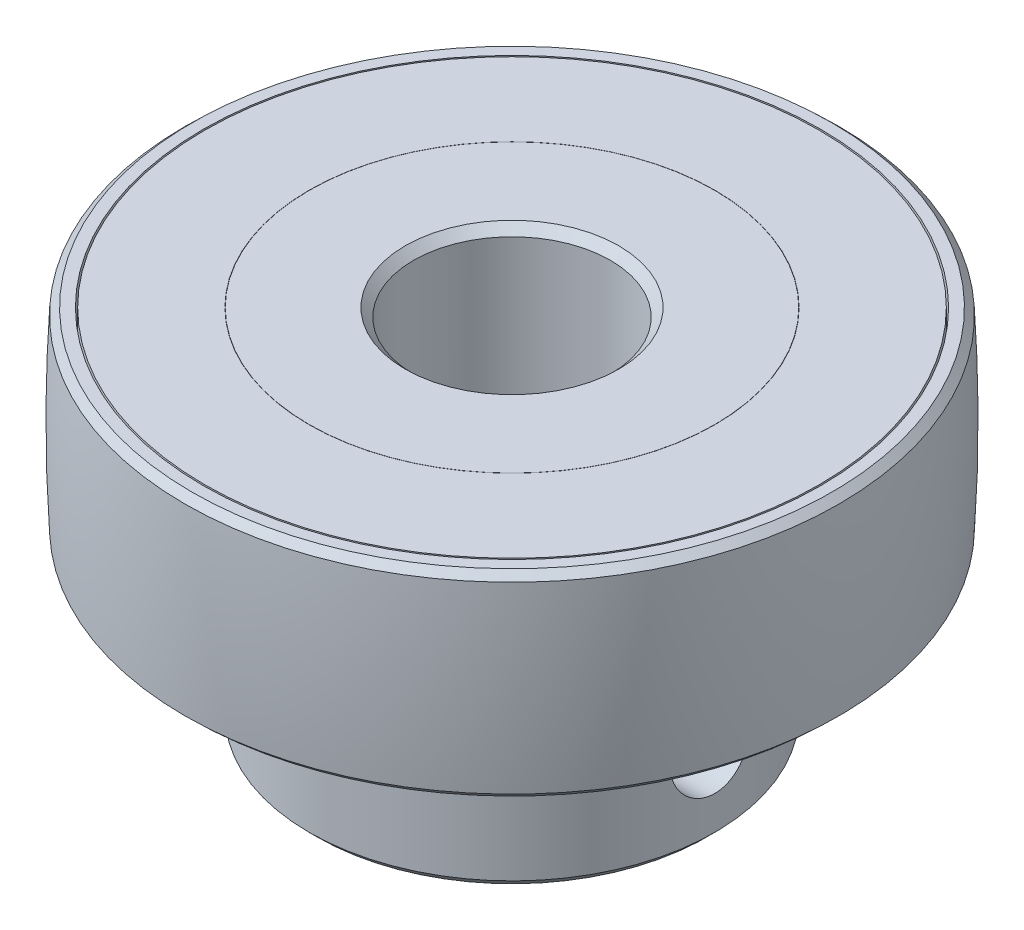
ISO-10303-21;
HEADER;
FILE_DESCRIPTION(('STEP AP214'),'2;1');
FILE_NAME('part.step','',(''),(''),'','','');
FILE_SCHEMA(('AUTOMOTIVE_DESIGN { 1 0 10303 214 1 1 1 1 }'));
ENDSEC;
DATA;
#1=APPLICATION_CONTEXT('core data for automotive mechanical design processes');
#2=APPLICATION_PROTOCOL_DEFINITION('international standard','automotive_design',2000,#1);
#3=PRODUCT_CONTEXT('',#1,'mechanical');
#4=PRODUCT('Part','Part','',(#3));
#5=PRODUCT_RELATED_PRODUCT_CATEGORY('part','',(#4));
#6=PRODUCT_DEFINITION_FORMATION('','',#4);
#7=PRODUCT_DEFINITION_CONTEXT('part definition',#1,'design');
#8=PRODUCT_DEFINITION('design','',#6,#7);
#9=PRODUCT_DEFINITION_SHAPE('','',#8);
#10=(LENGTH_UNIT() NAMED_UNIT(*) SI_UNIT(.MILLI.,.METRE.));
#11=(NAMED_UNIT(*) PLANE_ANGLE_UNIT() SI_UNIT($,.RADIAN.));
#12=(NAMED_UNIT(*) SI_UNIT($,.STERADIAN.) SOLID_ANGLE_UNIT());
#13=UNCERTAINTY_MEASURE_WITH_UNIT(LENGTH_MEASURE(1.E-05),#10,'distance_accuracy_value','');
#14=(GEOMETRIC_REPRESENTATION_CONTEXT(3) GLOBAL_UNCERTAINTY_ASSIGNED_CONTEXT((#13)) GLOBAL_UNIT_ASSIGNED_CONTEXT((#10,
#11,#12)) REPRESENTATION_CONTEXT('',''));
#15=CARTESIAN_POINT('',(0.,0.,0.));
#16=DIRECTION('',(0.,0.,1.));
#17=DIRECTION('',(1.,0.,0.));
#18=AXIS2_PLACEMENT_3D('',#15,#16,#17);
#19=CARTESIAN_POINT('',(0.,11.9380000000013,0.));
#20=DIRECTION('',(0.,-1.,0.));
#21=DIRECTION('',(0.,0.,-1.));
#22=AXIS2_PLACEMENT_3D('',#19,#20,#21);
#23=PLANE('',#22);
#24=CARTESIAN_POINT('',(0.,11.9380000000013,0.));
#25=DIRECTION('',(0.,1.,0.));
#26=DIRECTION('',(0.,0.,-1.));
#27=AXIS2_PLACEMENT_3D('',#24,#25,#26);
#28=CIRCLE('',#27,19.394391579374);
#29=CARTESIAN_POINT('',(0.,11.9380000000013,-19.394391579374));
#30=VERTEX_POINT('',#29);
#31=EDGE_CURVE('E8',#30,#30,#28,.T.);
#32=ORIENTED_EDGE('',*,*,#31,.T.);
#33=EDGE_LOOP('',(#32));
#34=FACE_BOUND('',#33,.T.);
#35=CARTESIAN_POINT('',(0.,11.9380000000013,0.));
#36=DIRECTION('',(0.,-1.,0.));
#37=DIRECTION('',(-1.,0.,0.));
#38=AXIS2_PLACEMENT_3D('',#35,#36,#37);
#39=CIRCLE('',#38,18.7139911849931);
#40=CARTESIAN_POINT('',(-18.7139911849931,11.9380000000013,0.));
#41=VERTEX_POINT('',#40);
#42=EDGE_CURVE('E26',#41,#41,#39,.T.);
#43=ORIENTED_EDGE('',*,*,#42,.T.);
#44=EDGE_LOOP('',(#43));
#45=FACE_BOUND('',#44,.T.);
#46=ADVANCED_FACE('F13',(#34,#45),#23,.F.);
#47=CARTESIAN_POINT('',(0.,8.03686552386424,0.));
#48=DIRECTION('',(0.,-1.,0.));
#49=DIRECTION('',(0.,0.,1.));
#50=AXIS2_PLACEMENT_3D('',#47,#48,#49);
#51=CYLINDRICAL_SURFACE('',#50,12.3063);
#52=CARTESIAN_POINT('',(0.,11.9380000000013,0.));
#53=DIRECTION('',(0.,-1.,0.));
#54=DIRECTION('',(0.,0.,-1.));
#55=AXIS2_PLACEMENT_3D('',#52,#53,#54);
#56=CIRCLE('',#55,12.3063);
#57=CARTESIAN_POINT('',(0.,11.9380000000013,-12.3063));
#58=VERTEX_POINT('',#57);
#59=EDGE_CURVE('E44',#58,#58,#56,.T.);
#60=ORIENTED_EDGE('',*,*,#59,.F.);
#61=EDGE_LOOP('',(#60));
#62=FACE_BOUND('',#61,.T.);
#63=CARTESIAN_POINT('',(0.,8.03686552386424,0.));
#64=DIRECTION('',(0.,-1.,0.));
#65=DIRECTION('',(1.,0.,0.));
#66=AXIS2_PLACEMENT_3D('',#63,#64,#65);
#67=CIRCLE('',#66,12.3063);
#68=CARTESIAN_POINT('',(12.3063,8.03686552386424,0.));
#69=VERTEX_POINT('',#68);
#70=EDGE_CURVE('E36',#69,#69,#67,.T.);
#71=ORIENTED_EDGE('',*,*,#70,.T.);
#72=EDGE_LOOP('',(#71));
#73=FACE_BOUND('',#72,.T.);
#74=ADVANCED_FACE('F139',(#62,#73),#51,.F.);
#75=CARTESIAN_POINT('',(0.,16.093155299926,0.));
#76=DIRECTION('',(0.,1.,0.));
#77=DIRECTION('',(0.,0.,-1.));
#78=AXIS2_PLACEMENT_3D('',#75,#76,#77);
#79=CYLINDRICAL_SURFACE('',#78,5.969);
#80=CARTESIAN_POINT('',(0.,-9.47419999999982,0.));
#81=DIRECTION('',(0.,-1.,0.));
#82=DIRECTION('',(0.,0.,-1.));
#83=AXIS2_PLACEMENT_3D('',#80,#81,#82);
#84=CIRCLE('',#83,5.969);
#85=CARTESIAN_POINT('',(0.,-9.47419999999982,-5.969));
#86=VERTEX_POINT('',#85);
#87=EDGE_CURVE('E49',#86,#86,#84,.T.);
#88=ORIENTED_EDGE('',*,*,#87,.T.);
#89=EDGE_LOOP('',(#88));
#90=FACE_BOUND('',#89,.T.);
#91=CARTESIAN_POINT('',(0.,11.4300000000013,0.));
#92=DIRECTION('',(0.,1.,0.));
#93=DIRECTION('',(0.,0.,1.));
#94=AXIS2_PLACEMENT_3D('',#91,#92,#93);
#95=CIRCLE('',#94,5.969);
#96=CARTESIAN_POINT('',(0.,11.4300000000013,5.969));
#97=VERTEX_POINT('',#96);
#98=EDGE_CURVE('E40',#97,#97,#95,.T.);
#99=ORIENTED_EDGE('',*,*,#98,.T.);
#100=EDGE_LOOP('',(#99));
#101=FACE_BOUND('',#100,.T.);
#102=CARTESIAN_POINT('',(5.9682610578208,-7.42769057174146,-0.0939198897985037));
#103=CARTESIAN_POINT('',(5.96618355826067,-7.42260952709357,-0.225502190928081));
#104=CARTESIAN_POINT('',(5.95972165357375,-7.40682071698288,-0.35681393906438));
#105=CARTESIAN_POINT('',(5.93867616688577,-7.35441734882008,-0.614769198294556));
#106=CARTESIAN_POINT('',(5.92407008795348,-7.31774509772245,-0.74139873781577));
#107=CARTESIAN_POINT('',(5.8883123465511,-7.22512514736992,-0.985872354378019));
#108=CARTESIAN_POINT('',(5.86718404144503,-7.16924615146235,-1.10374594859836));
#109=CARTESIAN_POINT('',(5.82044145847063,-7.04000057986972,-1.32838360432091));
#110=CARTESIAN_POINT('',(5.79482869858799,-6.96663991869549,-1.4351514056953));
#111=CARTESIAN_POINT('',(5.74025447457381,-6.80046305821227,-1.64018995058732));
#112=CARTESIAN_POINT('',(5.71119205918677,-6.70689261796218,-1.73782269688325));
#113=CARTESIAN_POINT('',(5.65375878349934,-6.50477202615346,-1.91645375145954));
#114=CARTESIAN_POINT('',(5.62538825005653,-6.39621494997861,-1.99744432688172));
#115=CARTESIAN_POINT('',(5.57146587041118,-6.16220160169033,-2.14336610386007));
#116=CARTESIAN_POINT('',(5.54605799223766,-6.03626716909311,-2.20758847920579));
#117=CARTESIAN_POINT('',(5.50269051246553,-5.77409524291605,-2.31358398724255));
#118=CARTESIAN_POINT('',(5.48472625202299,-5.63786425711923,-2.35537116663037));
#119=CARTESIAN_POINT('',(5.45963670566427,-5.36731191075546,-2.41293730429597));
#120=CARTESIAN_POINT('',(5.45194573825105,-5.23333404474966,-2.43007801081658));
#121=CARTESIAN_POINT('',(5.44663399275022,-4.96421315297604,-2.44196507576718));
#122=CARTESIAN_POINT('',(5.44900921025592,-4.82907061187248,-2.4367203392947));
#123=CARTESIAN_POINT('',(5.46298650047413,-4.57084539481564,-2.4052006369276));
#124=CARTESIAN_POINT('',(5.47397272242327,-4.44755336557484,-2.38032861563277));
#125=CARTESIAN_POINT('',(5.50306025814864,-4.20702195847819,-2.31228163487087));
#126=CARTESIAN_POINT('',(5.52116309995923,-4.08978388660892,-2.26910274451553));
#127=CARTESIAN_POINT('',(5.56318983703422,-3.86011928812828,-2.16406390552347));
#128=CARTESIAN_POINT('',(5.58729274844375,-3.74799756005532,-2.10161175822353));
#129=CARTESIAN_POINT('',(5.63841728280092,-3.5353323128462,-1.96031860649563));
#130=CARTESIAN_POINT('',(5.66544009924127,-3.43479356313641,-1.88147088821638));
#131=CARTESIAN_POINT('',(5.72195926824855,-3.23980141763226,-1.70224626753958));
#132=CARTESIAN_POINT('',(5.75148153613437,-3.14646650903273,-1.60065642922903));
#133=CARTESIAN_POINT('',(5.80773297969792,-2.97791357999453,-1.38269802076756));
#134=CARTESIAN_POINT('',(5.83446182813831,-2.90269768077769,-1.26632772267746));
#135=CARTESIAN_POINT('',(5.88245287625756,-2.77213365093105,-1.02053793652653));
#136=CARTESIAN_POINT('',(5.90366729836793,-2.71695761581257,-0.891017099376415));
#137=CARTESIAN_POINT('',(5.93788113061983,-2.62955436496951,-0.623438201486924));
#138=CARTESIAN_POINT('',(5.95088515730055,-2.5973142515452,-0.485384986362889));
#139=CARTESIAN_POINT('',(5.96658655837799,-2.55855497982119,-0.21446889650323));
#140=CARTESIAN_POINT('',(5.9699068076983,-2.55048047204291,-0.0818637299914671));
#141=CARTESIAN_POINT('',(5.96766641775805,-2.55596432986623,0.182806743059173));
#142=CARTESIAN_POINT('',(5.96210757021788,-2.5695183310324,0.314872153124825));
#143=CARTESIAN_POINT('',(5.94309521449112,-2.61672615971609,0.569443195431897));
#144=CARTESIAN_POINT('',(5.92995333519649,-2.64958746382751,0.692121165218756));
#145=CARTESIAN_POINT('',(5.89730638405821,-2.73354668496279,0.930152405721788));
#146=CARTESIAN_POINT('',(5.87780028831259,-2.78464753656636,1.04550449424943));
#147=CARTESIAN_POINT('',(5.83334537507662,-2.90590109047002,1.270727840806));
#148=CARTESIAN_POINT('',(5.80820990545257,-2.97673469526586,1.38019472222846));
#149=CARTESIAN_POINT('',(5.75538557671398,-3.13453845050661,1.58613357075538));
#150=CARTESIAN_POINT('',(5.72769558943217,-3.22151574791438,1.68259974955134));
#151=CARTESIAN_POINT('',(5.67053180089555,-3.4159934188274,1.86652634084198));
#152=CARTESIAN_POINT('',(5.64106274025891,-3.5244781937894,1.95295083357377));
#153=CARTESIAN_POINT('',(5.58553671220242,-3.75515460109224,2.10652065192487));
#154=CARTESIAN_POINT('',(5.55947994470205,-3.8773470357596,2.17366484822458));
#155=CARTESIAN_POINT('',(5.51406736902196,-4.1323458153482,2.28642414668383));
#156=CARTESIAN_POINT('',(5.4947039794342,-4.26513994067809,2.33206362807787));
#157=CARTESIAN_POINT('',(5.46540199495562,-4.53754434561494,2.3999466185128));
#158=CARTESIAN_POINT('',(5.45545596519322,-4.67714915655974,2.42220858528584));
#159=CARTESIAN_POINT('',(5.44686120152605,-4.94731800111781,2.44146565904115));
#160=CARTESIAN_POINT('',(5.44738269377558,-5.07772583755056,2.44031648124748));
#161=CARTESIAN_POINT('',(5.45762349871085,-5.33632401848732,2.41732532749997));
#162=CARTESIAN_POINT('',(5.46734245862054,-5.46451444784967,2.39548414520406));
#163=CARTESIAN_POINT('',(5.49428148891349,-5.71122867955336,2.33300894938325));
#164=CARTESIAN_POINT('',(5.51126911346044,-5.82992677969466,2.29295505915729));
#165=CARTESIAN_POINT('',(5.55075840787553,-6.05904723278183,2.19562947409319));
#166=CARTESIAN_POINT('',(5.5732617498769,-6.16946706282392,2.13835255676212));
#167=CARTESIAN_POINT('',(5.62313134014211,-6.38695169658725,2.00370560924863));
#168=CARTESIAN_POINT('',(5.65072341088006,-6.49328586227514,1.92523953580689));
#169=CARTESIAN_POINT('',(5.70671208258619,-6.69183081446967,1.7523280039146));
#170=CARTESIAN_POINT('',(5.73510892992053,-6.7840372194768,1.6578776072171));
#171=CARTESIAN_POINT('',(5.79157789886447,-6.95740048399799,1.44878818598967));
#172=CARTESIAN_POINT('',(5.81952529907194,-7.03754464687578,1.33327083012283));
#173=CARTESIAN_POINT('',(5.87009739407031,-7.17722111784339,1.08924135641701));
#174=CARTESIAN_POINT('',(5.89272021624267,-7.23674617779407,0.960724689458931));
#175=CARTESIAN_POINT('',(5.92946923477683,-7.33146495581238,0.698100368776805));
#176=CARTESIAN_POINT('',(5.94382648869041,-7.36732492178647,0.564269664829992));
#177=CARTESIAN_POINT('',(5.95851010906399,-7.40372868949144,0.360283156544792));
#178=CARTESIAN_POINT('',(5.96226231143924,-7.41296508241602,0.291808620532978));
#179=CARTESIAN_POINT('',(5.96740153213346,-7.42559298194474,0.154245874460932));
#180=CARTESIAN_POINT('',(5.96879017944642,-7.42898851416596,0.0851581200774797));
#181=CARTESIAN_POINT('',(5.96907824047698,-7.42969039062185,-0.0205953056710163));
#182=CARTESIAN_POINT('',(5.96883973815883,-7.42910587920569,-0.0572680935921073));
#183=CARTESIAN_POINT('',(5.9682610578208,-7.42769057174146,-0.0939198897985037));
#184=B_SPLINE_CURVE_WITH_KNOTS('',3,(#102,#103,#104,#105,#106,#107,#108,#109,#110,#111,#112,
#113,#114,#115,#116,#117,#118,#119,#120,#121,#122,#123,#124,#125,#126,#127,#128,#129,#130,#131,
#132,#133,#134,#135,#136,#137,#138,#139,#140,#141,#142,#143,#144,#145,#146,#147,#148,#149,#150,
#151,#152,#153,#154,#155,#156,#157,#158,#159,#160,#161,#162,#163,#164,#165,#166,#167,#168,#169,
#170,#171,#172,#173,#174,#175,#176,#177,#178,#179,#180,#181,#182,#183),.UNSPECIFIED.,.T.,.F.,(4,
2,2,2,2,2,2,2,2,2,2,2,2,2,2,2,2,2,2,2,2,2,2,2,2,2,2,2,2,2,2,2,2,2,2,2,2,2,2,2,4),(0.,
0.39496638874558,0.79102925066872,1.18568987369625,1.58021716167194,1.99334647592601,
2.40666732061076,2.83535133823183,3.26376664247041,3.66745842978151,4.07098964043529,
4.44803449644155,4.82516035332317,5.21527533915295,5.60555038956233,6.02683942315267,
6.44817775379083,6.87305331296157,7.29768975994879,7.69433571893025,8.09090164850329,
8.47222624292134,8.85361221672429,9.2502686646718,9.64710113678679,10.070512277917,
10.4939482147762,10.9169029534456,11.3395234962597,11.7287847965166,12.118031166958,
12.4956644155526,12.8734122885481,13.276680338756,13.68007320406,14.1079929061641,
14.5360628806373,14.9514991362461,15.1588563934447,15.366070679271,15.4760872047794),.UNSPECIFIED.);
#185=CARTESIAN_POINT('',(5.9682610578208,-7.42769057174146,-0.0939198897985037));
#186=VERTEX_POINT('',#185);
#187=EDGE_CURVE('E54',#186,#186,#184,.F.);
#188=ORIENTED_EDGE('',*,*,#187,.F.);
#189=EDGE_LOOP('',(#188));
#190=FACE_BOUND('',#189,.T.);
#191=CARTESIAN_POINT('',(-5.57695929966799,-4.8808567658156,2.12755398752811));
#192=CARTESIAN_POINT('',(-5.57463658713512,-4.74943992814297,2.13365058458326));
#193=CARTESIAN_POINT('',(-5.56815155904143,-4.61838537202592,2.15070773478656));
#194=CARTESIAN_POINT('',(-5.54665102068637,-4.36121873296488,2.20555298545431));
#195=CARTESIAN_POINT('',(-5.53161267395898,-4.2351208513232,2.24339657422646));
#196=CARTESIAN_POINT('',(-5.49265316913082,-3.99193193066546,2.3371499888412));
#197=CARTESIAN_POINT('',(-5.46876880975076,-3.87480597142999,2.39298484904777));
#198=CARTESIAN_POINT('',(-5.41154597251567,-3.65163069456766,2.51971240151981));
#199=CARTESIAN_POINT('',(-5.37820978971734,-3.54557869654567,2.59060143733861));
#200=CARTESIAN_POINT('',(-5.29925031769102,-3.34094834975205,2.74865990035269));
#201=CARTESIAN_POINT('',(-5.25303870369368,-3.24313199643224,2.83652337938817));
#202=CARTESIAN_POINT('',(-5.14865141953855,-3.06437881781581,3.0218626248878));
#203=CARTESIAN_POINT('',(-5.09047232739671,-2.98344683380216,3.11934113651843));
#204=CARTESIAN_POINT('',(-4.96012138922435,-2.83878653520445,3.3228183612478));
#205=CARTESIAN_POINT('',(-4.88761573751219,-2.77557856980968,3.42897558025807));
#206=CARTESIAN_POINT('',(-4.7301764228976,-2.67167717291551,3.64307631470309));
#207=CARTESIAN_POINT('',(-4.64524908741201,-2.63097232882785,3.75101889601964));
#208=CARTESIAN_POINT('',(-4.46996978639184,-2.57554170667253,3.95798210683568));
#209=CARTESIAN_POINT('',(-4.38023627286381,-2.55942106916619,4.0571526971702));
#210=CARTESIAN_POINT('',(-4.19365129202619,-2.54939184219125,4.24972975272973));
#211=CARTESIAN_POINT('',(-4.09680200195681,-2.55547648599578,4.34313796513103));
#212=CARTESIAN_POINT('',(-3.90418175999161,-2.58870259577486,4.51689277189611));
#213=CARTESIAN_POINT('',(-3.80860125428258,-2.61477038663471,4.59765988586115));
#214=CARTESIAN_POINT('',(-3.61699953897483,-2.6856686486789,4.74986903161749));
#215=CARTESIAN_POINT('',(-3.52097827917345,-2.73050131244,4.82130997241435));
#216=CARTESIAN_POINT('',(-3.32904348126299,-2.83891845639369,4.95586019407995));
#217=CARTESIAN_POINT('',(-3.23320452720639,-2.90298169021597,5.01868859454287));
#218=CARTESIAN_POINT('',(-3.04761428363163,-3.04754394585848,5.13351112181676));
#219=CARTESIAN_POINT('',(-2.95786542126107,-3.12804946993528,5.18550094592471));
#220=CARTESIAN_POINT('',(-2.78174524712235,-3.309701364253,5.28219979226686));
#221=CARTESIAN_POINT('',(-2.6960331658771,-3.41188799133565,5.32615993810304));
#222=CARTESIAN_POINT('',(-2.53898634083276,-3.63060122556626,5.40279223721744));
#223=CARTESIAN_POINT('',(-2.46765500330776,-3.74713121963286,5.43546171745425));
#224=CARTESIAN_POINT('',(-2.34215577976602,-3.99388520678392,5.4907254560175));
#225=CARTESIAN_POINT('',(-2.28828849025949,-4.12430240442987,5.51314573356955));
#226=CARTESIAN_POINT('',(-2.20306019984409,-4.39355465586885,5.54775978482736));
#227=CARTESIAN_POINT('',(-2.17168199407002,-4.53238318634646,5.5599613773595));
#228=CARTESIAN_POINT('',(-2.13528262864249,-4.8037293117022,5.57403620754184));
#229=CARTESIAN_POINT('',(-2.12852197241809,-4.93597881020274,5.57659158177115));
#230=CARTESIAN_POINT('',(-2.13701580390473,-5.19964910693102,5.5733425650285));
#231=CARTESIAN_POINT('',(-2.15226635457989,-5.33107004913595,5.56753966905943));
#232=CARTESIAN_POINT('',(-2.20240651290202,-5.58293733369809,5.54788530918557));
#233=CARTESIAN_POINT('',(-2.23633565420603,-5.70360892438931,5.53442647273845));
#234=CARTESIAN_POINT('',(-2.32105801990691,-5.93762344518,5.4994308265718));
#235=CARTESIAN_POINT('',(-2.37185555959227,-6.05096449109941,5.47789194962617));
#236=CARTESIAN_POINT('',(-2.49092452540767,-6.27393706275034,5.42482443108588));
#237=CARTESIAN_POINT('',(-2.56000414716181,-6.3830206261782,5.39281099816346));
#238=CARTESIAN_POINT('',(-2.7108456967987,-6.58820310985275,5.31858414519543));
#239=CARTESIAN_POINT('',(-2.79261308219814,-6.68429640902528,5.27636633145705));
#240=CARTESIAN_POINT('',(-2.9717662677468,-6.8678107978272,5.17771524278254));
#241=CARTESIAN_POINT('',(-3.06984965001661,-6.9541269164271,5.12048371174831));
#242=CARTESIAN_POINT('',(-3.27280644664168,-7.10713939724396,4.9931979938931));
#243=CARTESIAN_POINT('',(-3.37767929043076,-7.17383740550408,4.92314488365788));
#244=CARTESIAN_POINT('',(-3.58847366018629,-7.28450352924752,4.7716248995245));
#245=CARTESIAN_POINT('',(-3.69435810501426,-7.32878631775702,4.69033768048195));
#246=CARTESIAN_POINT('',(-3.90441254218111,-7.39418592497778,4.51697075908235));
#247=CARTESIAN_POINT('',(-4.00858345505842,-7.41531561079344,4.42489708271711));
#248=CARTESIAN_POINT('',(-4.20422082215378,-7.43282152731426,4.23915391601839));
#249=CARTESIAN_POINT('',(-4.29606784119354,-7.43080625659931,4.14603362595317));
#250=CARTESIAN_POINT('',(-4.47213304207051,-7.40597078302186,3.95547841021419));
#251=CARTESIAN_POINT('',(-4.55635188443565,-7.38315238341052,3.85804385920451));
#252=CARTESIAN_POINT('',(-4.71361500611781,-7.31832548985038,3.66416084858569));
#253=CARTESIAN_POINT('',(-4.78685357477648,-7.27672155741953,3.56773335702927));
#254=CARTESIAN_POINT('',(-4.9232582243416,-7.1758799462868,3.37701810410534));
#255=CARTESIAN_POINT('',(-4.9864220366034,-7.11663830449117,3.28273082876221));
#256=CARTESIAN_POINT('',(-5.10554819534854,-6.97856084325094,3.09441708850121));
#257=CARTESIAN_POINT('',(-5.16093989707833,-6.89884196772143,3.00067784808413));
#258=CARTESIAN_POINT('',(-5.26056561071941,-6.72366150965713,2.82238551820668));
#259=CARTESIAN_POINT('',(-5.30479462592863,-6.62819290865203,2.737836552153));
#260=CARTESIAN_POINT('',(-5.38500361096278,-6.41748390117107,2.57667992635922));
#261=CARTESIAN_POINT('',(-5.42033843624317,-6.30140646235764,2.50084109459808));
#262=CARTESIAN_POINT('',(-5.47996765114607,-6.05656909215221,2.36733835985366));
#263=CARTESIAN_POINT('',(-5.50426269490919,-5.92780991274213,2.30967338007646));
#264=CARTESIAN_POINT('',(-5.54050210806453,-5.67516866367883,2.22122511510803));
#265=CARTESIAN_POINT('',(-5.55347663386533,-5.55219770652257,2.18825258666769));
#266=CARTESIAN_POINT('',(-5.57147011576531,-5.30223061886554,2.14203651260763));
#267=CARTESIAN_POINT('',(-5.57651068633833,-5.17524638909091,2.12873937128419));
#268=CARTESIAN_POINT('',(-5.57792670940963,-5.02028870662693,2.12501489841794));
#269=CARTESIAN_POINT('',(-5.57799465840935,-4.99239211905747,2.12483806834194));
#270=CARTESIAN_POINT('',(-5.57775724184487,-4.93661051190155,2.12546116164321));
#271=CARTESIAN_POINT('',(-5.57745186243656,-4.90872549278244,2.12626112124274));
#272=CARTESIAN_POINT('',(-5.57695929966799,-4.8808567658156,2.12755398752811));
#273=B_SPLINE_CURVE_WITH_KNOTS('',3,(#191,#192,#193,#194,#195,#196,#197,#198,#199,#200,#201,
#202,#203,#204,#205,#206,#207,#208,#209,#210,#211,#212,#213,#214,#215,#216,#217,#218,#219,#220,
#221,#222,#223,#224,#225,#226,#227,#228,#229,#230,#231,#232,#233,#234,#235,#236,#237,#238,#239,
#240,#241,#242,#243,#244,#245,#246,#247,#248,#249,#250,#251,#252,#253,#254,#255,#256,#257,#258,
#259,#260,#261,#262,#263,#264,#265,#266,#267,#268,#269,#270,#271,#272),.UNSPECIFIED.,.T.,.F.,(4,
2,2,2,2,2,2,2,2,2,2,2,2,2,2,2,2,2,2,2,2,2,2,2,2,2,2,2,2,2,2,2,2,2,2,2,2,2,2,2,4),(0.,
0.39462047850009,0.790299531664581,1.18435074755118,1.57830636320507,1.99454455251065,
2.41090192694041,2.83844013866869,3.26576132253802,3.66779408777722,4.0697043497849,
4.45141480585255,4.83316987523705,5.22535253347786,5.61769058534639,6.03707220420578,
6.45655304287856,6.88291187522584,7.30894418030629,7.70421524680846,8.09941562188818,
8.47597140633006,8.8526235959105,9.25001683716569,9.64758148949618,10.0734593332859,
10.4993014339076,10.9189869884267,11.3384391884347,11.7289278915717,12.1193827496912,
12.5018027266377,12.884308696128,13.2874039248287,13.6906792704473,14.1178821489616,
14.5450597111047,14.9273135531491,15.3085242074359,15.392205741292,15.4758903784025),.UNSPECIFIED.);
#274=CARTESIAN_POINT('',(-5.57695929966799,-4.8808567658156,2.12755398752811));
#275=VERTEX_POINT('',#274);
#276=EDGE_CURVE('E119',#275,#275,#273,.F.);
#277=ORIENTED_EDGE('',*,*,#276,.T.);
#278=EDGE_LOOP('',(#277));
#279=FACE_BOUND('',#278,.T.);
#280=ADVANCED_FACE('F134',(#90,#101,#190,#279),#79,.F.);
#281=CARTESIAN_POINT('',(13.462,-4.99109999999982,0.));
#282=DIRECTION('',(-1.,0.,0.));
#283=DIRECTION('',(0.,1.,0.));
#284=AXIS2_PLACEMENT_3D('',#281,#282,#283);
#285=CYLINDRICAL_SURFACE('',#284,2.4384);
#286=CARTESIAN_POINT('',(12.2808180934617,-7.36421749576153,0.5604533078868));
#287=CARTESIAN_POINT('',(12.2747358155524,-7.33274790871379,0.693681957358205));
#288=CARTESIAN_POINT('',(12.2665867171079,-7.29003692377469,0.824233124290735));
#289=CARTESIAN_POINT('',(12.2470568177829,-7.18343168183621,1.07621014178348));
#290=CARTESIAN_POINT('',(12.2356729064277,-7.11951702622663,1.19762706638465));
#291=CARTESIAN_POINT('',(12.2109527164735,-6.97246140835832,1.42780613331364));
#292=CARTESIAN_POINT('',(12.1976183726894,-6.88933945276788,1.53658062712733));
#293=CARTESIAN_POINT('',(12.1704573377156,-6.70615381421236,1.73867356242355));
#294=CARTESIAN_POINT('',(12.1566307113743,-6.60609235621611,1.8319940305802));
#295=CARTESIAN_POINT('',(12.1298854231535,-6.3906790808783,2.00148205736833));
#296=CARTESIAN_POINT('',(12.1169766512894,-6.27519084700756,2.07747797446143));
#297=CARTESIAN_POINT('',(12.0936970397501,-6.03284125094738,2.20897548875763));
#298=CARTESIAN_POINT('',(12.0833261160699,-5.90598026539628,2.26447776434976));
#299=CARTESIAN_POINT('',(12.0664066035773,-5.64541251031288,2.35296885625631));
#300=CARTESIAN_POINT('',(12.0598309236128,-5.51176186196504,2.38611753054667));
#301=CARTESIAN_POINT('',(12.0511719005596,-5.24065339024665,2.42947658716272));
#302=CARTESIAN_POINT('',(12.049088000273,-5.10319604123383,2.43968981459888));
#303=CARTESIAN_POINT('',(12.0496573877929,-4.83094998199808,2.4368740100666));
#304=CARTESIAN_POINT('',(12.0522282854798,-4.69615672558607,2.42424921551558));
#305=CARTESIAN_POINT('',(12.0616455646971,-4.4306565684227,2.37694770017558));
#306=CARTESIAN_POINT('',(12.0684919620801,-4.29994968282468,2.34227089762211));
#307=CARTESIAN_POINT('',(12.0856717179358,-4.04628042904198,2.25194076104882));
#308=CARTESIAN_POINT('',(12.0960044734679,-3.92331672608973,2.19629105394813));
#309=CARTESIAN_POINT('',(12.1190006932045,-3.68838762677066,2.06562502076301));
#310=CARTESIAN_POINT('',(12.1316644135942,-3.57642344138433,1.99060656558752));
#311=CARTESIAN_POINT('',(12.1581699959722,-3.36458699212752,1.82178765318514));
#312=CARTESIAN_POINT('',(12.1720285323093,-3.26495921579106,1.72768290974));
#313=CARTESIAN_POINT('',(12.1991915844237,-3.0828021239869,1.52409104692739));
#314=CARTESIAN_POINT('',(12.2124960683244,-3.00027379123127,1.41460304408412));
#315=CARTESIAN_POINT('',(12.2371820751377,-2.85402888200438,1.18224948576373));
#316=CARTESIAN_POINT('',(12.2485472050235,-2.79046956906605,1.05928305887105));
#317=CARTESIAN_POINT('',(12.2679373505066,-2.68498111974754,0.804151642705904));
#318=CARTESIAN_POINT('',(12.2759626909194,-2.64304987980795,0.67198754942359));
#319=CARTESIAN_POINT('',(12.2876789219186,-2.5825480073782,0.404078412910722));
#320=CARTESIAN_POINT('',(12.2914259955247,-2.56367434196422,0.268404296381292));
#321=CARTESIAN_POINT('',(12.2943547960824,-2.54888588366524,-0.00423255585937476));
#322=CARTESIAN_POINT('',(12.2935369365344,-2.55296901131017,-0.141195173733728));
#323=CARTESIAN_POINT('',(12.2874719225718,-2.58374121005638,-0.410538865553126));
#324=CARTESIAN_POINT('',(12.2822856753589,-2.61011944411464,-0.542957013570828));
#325=CARTESIAN_POINT('',(12.2681312218381,-2.68425118364593,-0.801451412833163));
#326=CARTESIAN_POINT('',(12.2591628588002,-2.7320055749468,-0.927527401017858));
#327=CARTESIAN_POINT('',(12.2383419173753,-2.84786383621414,-1.17072531229358));
#328=CARTESIAN_POINT('',(12.226470517829,-2.91610118742338,-1.28778197035578));
#329=CARTESIAN_POINT('',(12.2011563496568,-3.07088558058612,-1.50890347350832));
#330=CARTESIAN_POINT('',(12.1877134028172,-3.15743469999824,-1.61296684238632));
#331=CARTESIAN_POINT('',(12.1604721039278,-3.348141401505,-1.80701411414175));
#332=CARTESIAN_POINT('',(12.146671603726,-3.45257455893337,-1.89672709570471));
#333=CARTESIAN_POINT('',(12.120492340058,-3.67515171318558,-2.05740466447183));
#334=CARTESIAN_POINT('',(12.1081135974608,-3.79329591121335,-2.12836897649684));
#335=CARTESIAN_POINT('',(12.0861811955478,-4.04025919078759,-2.24958755358477));
#336=CARTESIAN_POINT('',(12.0766320129189,-4.16909477951939,-2.29980905006092));
#337=CARTESIAN_POINT('',(12.0615170098955,-4.43360799048145,-2.37781488030014));
#338=CARTESIAN_POINT('',(12.055950672586,-4.56928472238396,-2.40560212576033));
#339=CARTESIAN_POINT('',(12.0495285344888,-4.84115686168556,-2.43756584689595));
#340=CARTESIAN_POINT('',(12.048594244447,-4.97730421967989,-2.4421357694146));
#341=CARTESIAN_POINT('',(12.0513336718415,-5.24841151057176,-2.42858063880442));
#342=CARTESIAN_POINT('',(12.0550071546501,-5.38337150357751,-2.41045674124448));
#343=CARTESIAN_POINT('',(12.0664763002011,-5.64703627813367,-2.35236176187245));
#344=CARTESIAN_POINT('',(12.0742347410667,-5.77578626445725,-2.31258784471958));
#345=CARTESIAN_POINT('',(12.0929692570169,-6.02479858696189,-2.21252594089627));
#346=CARTESIAN_POINT('',(12.1039456006237,-6.14506021378122,-2.15223624219223));
#347=CARTESIAN_POINT('',(12.1280605171883,-6.37542614619068,-2.01193038896028));
#348=CARTESIAN_POINT('',(12.1412257185148,-6.48537542460393,-1.93166435532838));
#349=CARTESIAN_POINT('',(12.1681560620167,-6.69038323999497,-1.75403249821439));
#350=CARTESIAN_POINT('',(12.1819212500225,-6.78544063688978,-1.65666536672676));
#351=CARTESIAN_POINT('',(12.2087461302974,-6.95939564276757,-1.44587397754334));
#352=CARTESIAN_POINT('',(12.2217924495669,-7.03803468919789,-1.33223439119078));
#353=CARTESIAN_POINT('',(12.2454946145096,-7.1751120936827,-1.09310425725886));
#354=CARTESIAN_POINT('',(12.2561501767584,-7.23354805710506,-0.967612307084731));
#355=CARTESIAN_POINT('',(12.2738125040934,-7.32815447968068,-0.709091408805811));
#356=CARTESIAN_POINT('',(12.2808401959022,-7.36445286102004,-0.576110708630041));
#357=CARTESIAN_POINT('',(12.2905359503781,-7.41413120189368,-0.305863335887509));
#358=CARTESIAN_POINT('',(12.2932081605994,-7.42753296556578,-0.168600867801905));
#359=CARTESIAN_POINT('',(12.2938153725016,-7.43057967183659,0.0682524706147163));
#360=CARTESIAN_POINT('',(12.2928524792278,-7.42575154642523,0.167805638723309));
#361=CARTESIAN_POINT('',(12.2885624393052,-7.40399771034411,0.365527693446089));
#362=CARTESIAN_POINT('',(12.2852353206202,-7.38707214276174,0.463696596419227));
#363=CARTESIAN_POINT('',(12.2808180934617,-7.36421749576153,0.5604533078868));
#364=B_SPLINE_CURVE_WITH_KNOTS('',3,(#286,#287,#288,#289,#290,#291,#292,#293,#294,#295,#296,
#297,#298,#299,#300,#301,#302,#303,#304,#305,#306,#307,#308,#309,#310,#311,#312,#313,#314,#315,
#316,#317,#318,#319,#320,#321,#322,#323,#324,#325,#326,#327,#328,#329,#330,#331,#332,#333,#334,
#335,#336,#337,#338,#339,#340,#341,#342,#343,#344,#345,#346,#347,#348,#349,#350,#351,#352,#353,
#354,#355,#356,#357,#358,#359,#360,#361,#362,#363),.UNSPECIFIED.,.T.,.F.,(4,2,2,2,2,2,2,2,2,2,2,
2,2,2,2,2,2,2,2,2,2,2,2,2,2,2,2,2,2,2,2,2,2,2,2,2,2,2,4),(0.,0.410722539049276,0.8218413577321,
1.23255508109565,1.64321489985182,2.05778177394609,2.47233492364508,2.88389110362829,
3.29539622781553,3.6996887614906,4.1039827942111,4.50820694298175,4.91247554463652,
5.32378321929292,5.73511452541859,6.14976686811262,6.56437887386165,6.97348112369378,
7.38254631686135,7.78600066795677,8.18947173974618,8.59563140023907,9.00183716402239,
9.41498290327953,9.82813470604849,10.2419367142399,10.6556850072487,11.0623978584355,
11.4690900006538,11.8721389356596,12.275221513186,12.6836246643604,13.0920590665344,
13.5065076393467,13.9210053191142,14.3330845479713,14.7447711401972,15.0430600773161,
15.3413454863606),.UNSPECIFIED.);
#365=CARTESIAN_POINT('',(12.2808180934617,-7.36421749576153,0.5604533078868));
#366=VERTEX_POINT('',#365);
#367=EDGE_CURVE('E126',#366,#366,#364,.F.);
#368=ORIENTED_EDGE('',*,*,#367,.T.);
#369=EDGE_LOOP('',(#368));
#370=FACE_BOUND('',#369,.T.);
#371=ORIENTED_EDGE('',*,*,#187,.T.);
#372=EDGE_LOOP('',(#371));
#373=FACE_BOUND('',#372,.T.);
#374=ADVANCED_FACE('F138',(#370,#373),#285,.F.);
#375=CARTESIAN_POINT('',(0.,11.4300000000013,0.));
#376=DIRECTION('',(0.,1.,0.));
#377=DIRECTION('',(0.,0.,1.));
#378=AXIS2_PLACEMENT_3D('',#375,#376,#377);
#379=CONICAL_SURFACE('',#378,5.969,0.785398163397448);
#380=CARTESIAN_POINT('',(0.,11.9380000000013,0.));
#381=DIRECTION('',(0.,-1.,0.));
#382=DIRECTION('',(0.,0.,-1.));
#383=AXIS2_PLACEMENT_3D('',#380,#381,#382);
#384=CIRCLE('',#383,6.477);
#385=CARTESIAN_POINT('',(0.,11.9380000000013,-6.477));
#386=VERTEX_POINT('',#385);
#387=EDGE_CURVE('E41',#386,#386,#384,.T.);
#388=ORIENTED_EDGE('',*,*,#387,.F.);
#389=EDGE_LOOP('',(#388));
#390=FACE_BOUND('',#389,.T.);
#391=ORIENTED_EDGE('',*,*,#98,.F.);
#392=EDGE_LOOP('',(#391));
#393=FACE_BOUND('',#392,.T.);
#394=ADVANCED_FACE('F310',(#390,#393),#379,.F.);
#395=CARTESIAN_POINT('',(-3.58279889412968,-4.99109999999982,3.57828573975515));
#396=DIRECTION('',(0.707106781186548,0.,-0.707106781186547));
#397=DIRECTION('',(0.707106781186547,0.,0.707106781186548));
#398=AXIS2_PLACEMENT_3D('',#395,#396,#397);
#399=CYLINDRICAL_SURFACE('',#398,2.4384);
#400=CARTESIAN_POINT('',(-10.201267508785,-5.60800076248612,6.86052054688325));
#401=CARTESIAN_POINT('',(-10.1815503861043,-5.74057914883111,6.88984090444904));
#402=CARTESIAN_POINT('',(-10.1553653124321,-5.87019783296189,6.92852562930168));
#403=CARTESIAN_POINT('',(-10.0903189446764,-6.11978571325896,7.02291417979943));
#404=CARTESIAN_POINT('',(-10.0514451732723,-6.23974526585798,7.07863475406946));
#405=CARTESIAN_POINT('',(-9.96148147291765,-6.46654113065752,7.20468317049231));
#406=CARTESIAN_POINT('',(-9.91040329319859,-6.57338991581702,7.27499695520302));
#407=CARTESIAN_POINT('',(-9.79662079596631,-6.77120447595855,7.42750641651823));
#408=CARTESIAN_POINT('',(-9.73391823136408,-6.86217264166426,7.50970030123968));
#409=CARTESIAN_POINT('',(-9.59716481295045,-7.02647170972341,7.68370723965778));
#410=CARTESIAN_POINT('',(-9.52302121812654,-7.09964460886134,7.77559676591895));
#411=CARTESIAN_POINT('',(-9.36507936662128,-7.22519559343926,7.96511669153748));
#412=CARTESIAN_POINT('',(-9.28128152002017,-7.27757456171582,8.06274684696598));
#413=CARTESIAN_POINT('',(-9.10663078187677,-7.35954286708593,8.25947992165111));
#414=CARTESIAN_POINT('',(-9.01584927399476,-7.38933587168623,8.35856126174639));
#415=CARTESIAN_POINT('',(-8.82885829254938,-7.42595792238801,8.55583543775015));
#416=CARTESIAN_POINT('',(-8.73264942259464,-7.43278951706245,8.65402837105958));
#417=CARTESIAN_POINT('',(-8.53915348906408,-7.42334942596336,8.84497825028894));
#418=CARTESIAN_POINT('',(-8.44190957839265,-7.4074525987603,8.93779772273037));
#419=CARTESIAN_POINT('',(-8.24777781467293,-7.35373362151268,9.11724973118884));
#420=CARTESIAN_POINT('',(-8.15088996451402,-7.31591129393952,9.20388221710408));
#421=CARTESIAN_POINT('',(-7.96043408813736,-7.21942380331888,9.36909926643878));
#422=CARTESIAN_POINT('',(-7.86687102987781,-7.16072878277261,9.44767209232414));
#423=CARTESIAN_POINT('',(-7.68631591899124,-7.02419524322568,9.59514228953016));
#424=CARTESIAN_POINT('',(-7.59932458719157,-6.94635462819214,9.66403860018116));
#425=CARTESIAN_POINT('',(-7.43352584537005,-6.77217972448196,9.79216389159271));
#426=CARTESIAN_POINT('',(-7.35488227839399,-6.67555414282189,9.85120907391494));
#427=CARTESIAN_POINT('',(-7.21045385473923,-6.46731071394702,9.95740993849727));
#428=CARTESIAN_POINT('',(-7.14466968924342,-6.35569206140996,10.0045649817111));
#429=CARTESIAN_POINT('',(-7.02819156797175,-6.11964801521547,10.0867368215323));
#430=CARTESIAN_POINT('',(-6.97760578715282,-5.99513892146286,10.121666883327));
#431=CARTESIAN_POINT('',(-6.89436266853022,-5.73746418378912,10.1785522050253));
#432=CARTESIAN_POINT('',(-6.86170334875337,-5.60429949866306,10.200508899302));
#433=CARTESIAN_POINT('',(-6.8161552516513,-5.33512535329135,10.2310007822263));
#434=CARTESIAN_POINT('',(-6.80298989876194,-5.19918399337199,10.2397237720581));
#435=CARTESIAN_POINT('',(-6.79616719859458,-4.92660460787026,10.24425362844));
#436=CARTESIAN_POINT('',(-6.80250816565251,-4.78996664350459,10.2400616110573));
#437=CARTESIAN_POINT('',(-6.8341779844028,-4.52179211770567,10.2189509518273));
#438=CARTESIAN_POINT('',(-6.85925174042687,-4.39021176838198,10.2022032774037));
#439=CARTESIAN_POINT('',(-6.926963542632,-4.13390615261845,10.156349520804));
#440=CARTESIAN_POINT('',(-6.96960260726062,-4.00918128413903,10.1272427220353));
#441=CARTESIAN_POINT('',(-7.07107859471161,-3.76889947090422,10.0566537106081));
#442=CARTESIAN_POINT('',(-7.13005327641289,-3.65343177509565,10.0150659851323));
#443=CARTESIAN_POINT('',(-7.26166741964019,-3.43593307549129,9.92004824206822));
#444=CARTESIAN_POINT('',(-7.33430840033046,-3.3339035676483,9.86661690781061));
#445=CARTESIAN_POINT('',(-7.49187069023764,-3.14435582532327,9.7475315443789));
#446=CARTESIAN_POINT('',(-7.57698120803974,-3.05711640634546,9.68168364711659));
#447=CARTESIAN_POINT('',(-7.75539122343601,-2.90176023465506,9.53936625834164));
#448=CARTESIAN_POINT('',(-7.84869068936417,-2.83364340800123,9.46289680790102));
#449=CARTESIAN_POINT('',(-8.04012029823251,-2.71857676808094,9.30079390786288));
#450=CARTESIAN_POINT('',(-8.13824671055541,-2.67161088429973,9.21516747717568));
#451=CARTESIAN_POINT('',(-8.33605430080263,-2.60024293245103,9.03662175112396));
#452=CARTESIAN_POINT('',(-8.43573528662133,-2.57583809853074,8.94370335122786));
#453=CARTESIAN_POINT('',(-8.63174898238991,-2.55059662703972,8.75464091994701));
#454=CARTESIAN_POINT('',(-8.72810980658589,-2.54936721447155,8.65857834441071));
#455=CARTESIAN_POINT('',(-8.9164235451501,-2.56951065598974,8.46453021214687));
#456=CARTESIAN_POINT('',(-9.00837663812339,-2.59088259343926,8.36654473356417));
#457=CARTESIAN_POINT('',(-9.18488626515048,-2.65532421457553,8.17236663901185));
#458=CARTESIAN_POINT('',(-9.26948925409755,-2.69824389620866,8.07616633211236));
#459=CARTESIAN_POINT('',(-9.43016642286504,-2.80441765358092,7.88795849227881));
#460=CARTESIAN_POINT('',(-9.50623988957192,-2.86767342781856,7.79595131029346));
#461=CARTESIAN_POINT('',(-9.64945024508503,-3.01371983599973,7.61800152814505));
#462=CARTESIAN_POINT('',(-9.7164520916955,-3.09676352791265,7.53215798358732));
#463=CARTESIAN_POINT('',(-9.83928127612358,-3.27963024421262,7.37098585583011));
#464=CARTESIAN_POINT('',(-9.89510776713204,-3.37945453909111,7.29565806958979));
#465=CARTESIAN_POINT('',(-9.99557600157752,-3.59469346996263,7.15740751989444));
#466=CARTESIAN_POINT('',(-10.0400542307204,-3.71030276059181,7.09466862181914));
#467=CARTESIAN_POINT('',(-10.1163188124107,-3.95288289842208,6.98549578045573));
#468=CARTESIAN_POINT('',(-10.1481038123999,-4.0798549546469,6.9390635748308));
#469=CARTESIAN_POINT('',(-10.1984613306515,-4.34062506430522,6.86483770876513));
#470=CARTESIAN_POINT('',(-10.2171253864193,-4.47436870435015,6.83691499762669));
#471=CARTESIAN_POINT('',(-10.2413927189387,-4.74555098014745,6.80051293915418));
#472=CARTESIAN_POINT('',(-10.2470084876487,-4.88298595430096,6.79201499537638));
#473=CARTESIAN_POINT('',(-10.2454212787886,-5.11935979319465,6.794402940999));
#474=CARTESIAN_POINT('',(-10.2413414481718,-5.21840422525718,6.80056663919979));
#475=CARTESIAN_POINT('',(-10.2263897344012,-5.41481468937293,6.8230299527017));
#476=CARTESIAN_POINT('',(-10.2155179101519,-5.51218073597469,6.83932948009829));
#477=CARTESIAN_POINT('',(-10.201267508785,-5.60800076248612,6.86052054688325));
#478=B_SPLINE_CURVE_WITH_KNOTS('',3,(#400,#401,#402,#403,#404,#405,#406,#407,#408,#409,#410,
#411,#412,#413,#414,#415,#416,#417,#418,#419,#420,#421,#422,#423,#424,#425,#426,#427,#428,#429,
#430,#431,#432,#433,#434,#435,#436,#437,#438,#439,#440,#441,#442,#443,#444,#445,#446,#447,#448,
#449,#450,#451,#452,#453,#454,#455,#456,#457,#458,#459,#460,#461,#462,#463,#464,#465,#466,#467,
#468,#469,#470,#471,#472,#473,#474,#475,#476,#477),.UNSPECIFIED.,.T.,.F.,(4,2,2,2,2,2,2,2,2,2,2,
2,2,2,2,2,2,2,2,2,2,2,2,2,2,2,2,2,2,2,2,2,2,2,2,2,2,2,4),(0.,0.411251741631194,
0.822909108569955,1.23417175688641,1.64537243880234,2.06010076735808,2.47481148613615,
2.88573657372632,3.29661604969399,3.70079657068789,4.10498036433693,4.50974466689649,
4.91455330222471,5.32622827024728,5.73792535940087,6.15248684189288,6.56700248068358,
6.97557876519893,7.38411974305415,7.78719652005403,8.19029667098723,8.59690548492981,
9.00355952479187,9.41718628138258,9.83081143858242,10.2441217904055,10.6573814660738,
11.0636308359167,11.4698637302452,11.8733071004703,12.2767841756003,12.685727788631,
13.0947023775187,13.5092736511669,13.9238890886949,14.3355824844858,14.7468815772086,
15.044113242388,15.3413423298158),.UNSPECIFIED.);
#479=CARTESIAN_POINT('',(-10.201267508785,-5.60800076248612,6.86052054688325));
#480=VERTEX_POINT('',#479);
#481=EDGE_CURVE('E17',#480,#480,#478,.F.);
#482=ORIENTED_EDGE('',*,*,#481,.F.);
#483=EDGE_LOOP('',(#482));
#484=FACE_BOUND('',#483,.T.);
#485=ORIENTED_EDGE('',*,*,#276,.F.);
#486=EDGE_LOOP('',(#485));
#487=FACE_BOUND('',#486,.T.);
#488=ADVANCED_FACE('F130',(#484,#487),#399,.F.);
#489=CARTESIAN_POINT('',(0.,5.96900000000072,0.));
#490=DIRECTION('',(0.,-1.,0.));
#491=DIRECTION('',(0.,0.,-1.));
#492=AXIS2_PLACEMENT_3D('',#489,#490,#491);
#493=DEGENERATE_TOROIDAL_SURFACE('',#492,81.6228999999633,101.599999999963,.F.);
#494=CARTESIAN_POINT('',(0.,0.407426472853054,0.));
#495=DIRECTION('',(0.,1.,0.));
#496=DIRECTION('',(0.,0.,1.));
#497=AXIS2_PLACEMENT_3D('',#494,#495,#496);
#498=CIRCLE('',#497,19.824765817909);
#499=CARTESIAN_POINT('',(0.,0.407426472853054,19.824765817909));
#500=VERTEX_POINT('',#499);
#501=EDGE_CURVE('E50',#500,#500,#498,.T.);
#502=ORIENTED_EDGE('',*,*,#501,.T.);
#503=EDGE_LOOP('',(#502));
#504=FACE_BOUND('',#503,.T.);
#505=CARTESIAN_POINT('',(0.,11.5305735271484,0.));
#506=DIRECTION('',(0.,-1.,0.));
#507=DIRECTION('',(0.,0.,-1.));
#508=AXIS2_PLACEMENT_3D('',#505,#506,#507);
#509=CIRCLE('',#508,19.824765817909);
#510=CARTESIAN_POINT('',(0.,11.5305735271484,-19.824765817909));
#511=VERTEX_POINT('',#510);
#512=EDGE_CURVE('E55',#511,#511,#509,.T.);
#513=ORIENTED_EDGE('',*,*,#512,.T.);
#514=EDGE_LOOP('',(#513));
#515=FACE_BOUND('',#514,.T.);
#516=ADVANCED_FACE('F15',(#504,#515),#493,.F.);
#517=CARTESIAN_POINT('',(0.,-9.98219999999982,0.));
#518=DIRECTION('',(0.,-1.,0.));
#519=DIRECTION('',(0.,0.,1.));
#520=AXIS2_PLACEMENT_3D('',#517,#518,#519);
#521=CYLINDRICAL_SURFACE('',#520,12.2936);
#522=CARTESIAN_POINT('',(0.,3.78661125842841,0.));
#523=DIRECTION('',(0.,1.,0.));
#524=DIRECTION('',(0.,0.,1.));
#525=AXIS2_PLACEMENT_3D('',#522,#523,#524);
#526=CIRCLE('',#525,12.2936);
#527=CARTESIAN_POINT('',(0.,3.78661125842841,12.2936));
#528=VERTEX_POINT('',#527);
#529=EDGE_CURVE('E79',#528,#528,#526,.T.);
#530=ORIENTED_EDGE('',*,*,#529,.F.);
#531=EDGE_LOOP('',(#530));
#532=FACE_BOUND('',#531,.T.);
#533=CARTESIAN_POINT('',(0.,-9.47419999999982,0.));
#534=DIRECTION('',(0.,1.,0.));
#535=DIRECTION('',(0.,0.,1.));
#536=AXIS2_PLACEMENT_3D('',#533,#534,#535);
#537=CIRCLE('',#536,12.2936);
#538=CARTESIAN_POINT('',(0.,-9.47419999999982,12.2936));
#539=VERTEX_POINT('',#538);
#540=EDGE_CURVE('E56',#539,#539,#537,.T.);
#541=ORIENTED_EDGE('',*,*,#540,.T.);
#542=EDGE_LOOP('',(#541));
#543=FACE_BOUND('',#542,.T.);
#544=ORIENTED_EDGE('',*,*,#367,.F.);
#545=EDGE_LOOP('',(#544));
#546=FACE_BOUND('',#545,.T.);
#547=ORIENTED_EDGE('',*,*,#481,.T.);
#548=EDGE_LOOP('',(#547));
#549=FACE_BOUND('',#548,.T.);
#550=ADVANCED_FACE('F160',(#532,#543,#546,#549),#521,.T.);
#551=CARTESIAN_POINT('',(0.,-9.98219999999982,0.));
#552=DIRECTION('',(0.,1.,0.));
#553=DIRECTION('',(1.,0.,0.));
#554=AXIS2_PLACEMENT_3D('',#551,#552,#553);
#555=PLANE('',#554);
#556=CARTESIAN_POINT('',(0.,-9.98219999999982,0.));
#557=DIRECTION('',(0.,-1.,0.));
#558=DIRECTION('',(0.,0.,1.));
#559=AXIS2_PLACEMENT_3D('',#556,#557,#558);
#560=CIRCLE('',#559,11.7856);
#561=CARTESIAN_POINT('',(0.,-9.98219999999982,11.7856));
#562=VERTEX_POINT('',#561);
#563=EDGE_CURVE('E70',#562,#562,#560,.T.);
#564=ORIENTED_EDGE('',*,*,#563,.T.);
#565=EDGE_LOOP('',(#564));
#566=FACE_BOUND('',#565,.T.);
#567=CARTESIAN_POINT('',(0.,-9.98219999999982,0.));
#568=DIRECTION('',(0.,1.,0.));
#569=DIRECTION('',(0.,0.,1.));
#570=AXIS2_PLACEMENT_3D('',#567,#568,#569);
#571=CIRCLE('',#570,6.477);
#572=CARTESIAN_POINT('',(0.,-9.98219999999982,6.477));
#573=VERTEX_POINT('',#572);
#574=EDGE_CURVE('E74',#573,#573,#571,.T.);
#575=ORIENTED_EDGE('',*,*,#574,.T.);
#576=EDGE_LOOP('',(#575));
#577=FACE_BOUND('',#576,.T.);
#578=ADVANCED_FACE('F163',(#566,#577),#555,.F.);
#579=CARTESIAN_POINT('',(0.,8.03686552386424,0.));
#580=DIRECTION('',(0.,-1.,0.));
#581=DIRECTION('',(0.,0.,1.));
#582=AXIS2_PLACEMENT_3D('',#579,#580,#581);
#583=CYLINDRICAL_SURFACE('',#582,12.2936);
#584=CARTESIAN_POINT('',(0.,11.9380000000013,0.));
#585=DIRECTION('',(0.,-1.,0.));
#586=DIRECTION('',(0.,0.,-1.));
#587=AXIS2_PLACEMENT_3D('',#584,#585,#586);
#588=CIRCLE('',#587,12.2936);
#589=CARTESIAN_POINT('',(0.,11.9380000000013,-12.2936));
#590=VERTEX_POINT('',#589);
#591=EDGE_CURVE('E75',#590,#590,#588,.T.);
#592=ORIENTED_EDGE('',*,*,#591,.T.);
#593=EDGE_LOOP('',(#592));
#594=FACE_BOUND('',#593,.T.);
#595=CARTESIAN_POINT('',(0.,8.03686552386424,0.));
#596=DIRECTION('',(0.,-1.,0.));
#597=DIRECTION('',(1.,0.,0.));
#598=AXIS2_PLACEMENT_3D('',#595,#596,#597);
#599=CIRCLE('',#598,12.2936);
#600=CARTESIAN_POINT('',(12.2936,8.03686552386424,0.));
#601=VERTEX_POINT('',#600);
#602=EDGE_CURVE('E64',#601,#601,#599,.T.);
#603=ORIENTED_EDGE('',*,*,#602,.F.);
#604=EDGE_LOOP('',(#603));
#605=FACE_BOUND('',#604,.T.);
#606=ADVANCED_FACE('F292',(#594,#605),#583,.T.);
#607=CARTESIAN_POINT('',(0.,3.78661125842841,0.));
#608=DIRECTION('',(0.,1.,0.));
#609=DIRECTION('',(1.,0.,0.));
#610=AXIS2_PLACEMENT_3D('',#607,#608,#609);
#611=PLANE('',#610);
#612=CARTESIAN_POINT('',(0.,3.78661125842841,0.));
#613=DIRECTION('',(0.,1.,0.));
#614=DIRECTION('',(0.,0.,1.));
#615=AXIS2_PLACEMENT_3D('',#612,#613,#614);
#616=CIRCLE('',#615,12.3063);
#617=CARTESIAN_POINT('',(0.,3.78661125842841,12.3063));
#618=VERTEX_POINT('',#617);
#619=EDGE_CURVE('E86',#618,#618,#616,.T.);
#620=ORIENTED_EDGE('',*,*,#619,.F.);
#621=EDGE_LOOP('',(#620));
#622=FACE_BOUND('',#621,.T.);
#623=ORIENTED_EDGE('',*,*,#529,.T.);
#624=EDGE_LOOP('',(#623));
#625=FACE_BOUND('',#624,.T.);
#626=ADVANCED_FACE('F267',(#622,#625),#611,.F.);
#627=CARTESIAN_POINT('',(0.,-9.47419999999982,0.));
#628=DIRECTION('',(0.,1.,0.));
#629=DIRECTION('',(0.,0.,1.));
#630=AXIS2_PLACEMENT_3D('',#627,#628,#629);
#631=CONICAL_SURFACE('',#630,12.2936,0.785398163397448);
#632=ORIENTED_EDGE('',*,*,#540,.F.);
#633=EDGE_LOOP('',(#632));
#634=FACE_BOUND('',#633,.T.);
#635=ORIENTED_EDGE('',*,*,#563,.F.);
#636=EDGE_LOOP('',(#635));
#637=FACE_BOUND('',#636,.T.);
#638=ADVANCED_FACE('F216',(#634,#637),#631,.T.);
#639=CARTESIAN_POINT('',(0.,11.9380000000013,0.));
#640=DIRECTION('',(0.,-1.,0.));
#641=DIRECTION('',(0.,0.,-1.));
#642=AXIS2_PLACEMENT_3D('',#639,#640,#641);
#643=CONICAL_SURFACE('',#642,19.394391579374,0.812781799131016);
#644=ORIENTED_EDGE('',*,*,#512,.F.);
#645=EDGE_LOOP('',(#644));
#646=FACE_BOUND('',#645,.T.);
#647=ORIENTED_EDGE('',*,*,#31,.F.);
#648=EDGE_LOOP('',(#647));
#649=FACE_BOUND('',#648,.T.);
#650=ADVANCED_FACE('F185',(#646,#649),#643,.T.);
#651=CARTESIAN_POINT('',(0.,-9.98219999999982,0.));
#652=DIRECTION('',(0.,-1.,0.));
#653=DIRECTION('',(0.,0.,-1.));
#654=AXIS2_PLACEMENT_3D('',#651,#652,#653);
#655=CONICAL_SURFACE('',#654,6.477,0.78539816339745);
#656=ORIENTED_EDGE('',*,*,#574,.F.);
#657=EDGE_LOOP('',(#656));
#658=FACE_BOUND('',#657,.T.);
#659=ORIENTED_EDGE('',*,*,#87,.F.);
#660=EDGE_LOOP('',(#659));
#661=FACE_BOUND('',#660,.T.);
#662=ADVANCED_FACE('F178',(#658,#661),#655,.F.);
#663=CARTESIAN_POINT('',(0.,3.78661125842841,0.));
#664=DIRECTION('',(0.,1.,0.));
#665=DIRECTION('',(0.,0.,-1.));
#666=AXIS2_PLACEMENT_3D('',#663,#664,#665);
#667=CYLINDRICAL_SURFACE('',#666,12.3063);
#668=CARTESIAN_POINT('',(0.,1.80411241501588E-13,0.));
#669=DIRECTION('',(0.,1.,0.));
#670=DIRECTION('',(0.,0.,1.));
#671=AXIS2_PLACEMENT_3D('',#668,#669,#670);
#672=CIRCLE('',#671,12.3063);
#673=CARTESIAN_POINT('',(0.,1.80411241501588E-13,12.3063));
#674=VERTEX_POINT('',#673);
#675=EDGE_CURVE('E45',#674,#674,#672,.T.);
#676=ORIENTED_EDGE('',*,*,#675,.F.);
#677=EDGE_LOOP('',(#676));
#678=FACE_BOUND('',#677,.T.);
#679=ORIENTED_EDGE('',*,*,#619,.T.);
#680=EDGE_LOOP('',(#679));
#681=FACE_BOUND('',#680,.T.);
#682=ADVANCED_FACE('F184',(#678,#681),#667,.F.);
#683=CARTESIAN_POINT('',(0.,3.78661125842841,0.));
#684=DIRECTION('',(0.,1.,0.));
#685=DIRECTION('',(1.,0.,0.));
#686=AXIS2_PLACEMENT_3D('',#683,#684,#685);
#687=CIRCLE('',#686,18.6597650065703);
#688=CARTESIAN_POINT('',(18.6597650065703,3.78661125842841,0.));
#689=VERTEX_POINT('',#688);
#690=EDGE_CURVE('E87',#689,#689,#687,.T.);
#691=ORIENTED_EDGE('',*,*,#690,.F.);
#692=EDGE_LOOP('',(#691));
#693=FACE_BOUND('',#692,.T.);
#694=CARTESIAN_POINT('',(0.,3.78661125842841,0.));
#695=DIRECTION('',(0.,1.,0.));
#696=DIRECTION('',(1.,0.,0.));
#697=AXIS2_PLACEMENT_3D('',#694,#695,#696);
#698=CIRCLE('',#697,18.6176356246298);
#699=CARTESIAN_POINT('',(18.6176356246298,3.78661125842841,0.));
#700=VERTEX_POINT('',#699);
#701=EDGE_CURVE('E91',#700,#700,#698,.T.);
#702=ORIENTED_EDGE('',*,*,#701,.T.);
#703=EDGE_LOOP('',(#702));
#704=FACE_BOUND('',#703,.T.);
#705=ADVANCED_FACE('F276',(#693,#704),#611,.F.);
#706=CARTESIAN_POINT('',(0.,3.78661125842841,0.));
#707=DIRECTION('',(0.,1.,0.));
#708=DIRECTION('',(0.,0.,-1.));
#709=AXIS2_PLACEMENT_3D('',#706,#707,#708);
#710=CYLINDRICAL_SURFACE('',#709,18.6597650065703);
#711=CARTESIAN_POINT('',(0.,1.80411241501588E-13,0.));
#712=DIRECTION('',(0.,1.,0.));
#713=DIRECTION('',(1.,0.,0.));
#714=AXIS2_PLACEMENT_3D('',#711,#712,#713);
#715=CIRCLE('',#714,18.6597650065703);
#716=CARTESIAN_POINT('',(18.6597650065703,1.80411241501588E-13,0.));
#717=VERTEX_POINT('',#716);
#718=EDGE_CURVE('E102',#717,#717,#715,.T.);
#719=ORIENTED_EDGE('',*,*,#718,.F.);
#720=EDGE_LOOP('',(#719));
#721=FACE_BOUND('',#720,.T.);
#722=ORIENTED_EDGE('',*,*,#690,.T.);
#723=EDGE_LOOP('',(#722));
#724=FACE_BOUND('',#723,.T.);
#725=ADVANCED_FACE('F203',(#721,#724),#710,.F.);
#726=CARTESIAN_POINT('',(0.,11.9380000000013,0.));
#727=DIRECTION('',(0.,-1.,0.));
#728=DIRECTION('',(-1.,0.,0.));
#729=AXIS2_PLACEMENT_3D('',#726,#727,#728);
#730=CIRCLE('',#729,18.6176356246298);
#731=CARTESIAN_POINT('',(-18.6176356246298,11.9380000000013,0.));
#732=VERTEX_POINT('',#731);
#733=EDGE_CURVE('E65',#732,#732,#730,.T.);
#734=ORIENTED_EDGE('',*,*,#733,.F.);
#735=EDGE_LOOP('',(#734));
#736=FACE_BOUND('',#735,.T.);
#737=ORIENTED_EDGE('',*,*,#59,.T.);
#738=EDGE_LOOP('',(#737));
#739=FACE_BOUND('',#738,.T.);
#740=ADVANCED_FACE('F197',(#736,#739),#23,.F.);
#741=ORIENTED_EDGE('',*,*,#591,.F.);
#742=EDGE_LOOP('',(#741));
#743=FACE_BOUND('',#742,.T.);
#744=ORIENTED_EDGE('',*,*,#387,.T.);
#745=EDGE_LOOP('',(#744));
#746=FACE_BOUND('',#745,.T.);
#747=ADVANCED_FACE('F202',(#743,#746),#23,.F.);
#748=CARTESIAN_POINT('',(-19.801609064624,1.80411241501588E-13,0.));
#749=DIRECTION('',(0.,1.,0.));
#750=DIRECTION('',(1.,0.,0.));
#751=AXIS2_PLACEMENT_3D('',#748,#749,#750);
#752=PLANE('',#751);
#753=CARTESIAN_POINT('',(0.,1.80411241501588E-13,0.));
#754=DIRECTION('',(0.,1.,0.));
#755=DIRECTION('',(1.,0.,0.));
#756=AXIS2_PLACEMENT_3D('',#753,#754,#755);
#757=CIRCLE('',#756,18.6176356246298);
#758=CARTESIAN_POINT('',(18.6176356246298,1.80411241501588E-13,0.));
#759=VERTEX_POINT('',#758);
#760=EDGE_CURVE('E60',#759,#759,#757,.T.);
#761=ORIENTED_EDGE('',*,*,#760,.F.);
#762=EDGE_LOOP('',(#761));
#763=FACE_BOUND('',#762,.T.);
#764=ORIENTED_EDGE('',*,*,#675,.T.);
#765=EDGE_LOOP('',(#764));
#766=FACE_BOUND('',#765,.T.);
#767=ADVANCED_FACE('F228',(#763,#766),#752,.F.);
#768=CARTESIAN_POINT('',(0.,1.80411241501588E-13,0.));
#769=DIRECTION('',(0.,-1.,0.));
#770=DIRECTION('',(0.,0.,1.));
#771=AXIS2_PLACEMENT_3D('',#768,#769,#770);
#772=CIRCLE('',#771,19.394391579374);
#773=CARTESIAN_POINT('',(0.,1.80411241501588E-13,19.394391579374));
#774=VERTEX_POINT('',#773);
#775=EDGE_CURVE('E98',#774,#774,#772,.T.);
#776=ORIENTED_EDGE('',*,*,#775,.T.);
#777=EDGE_LOOP('',(#776));
#778=FACE_BOUND('',#777,.T.);
#779=ORIENTED_EDGE('',*,*,#718,.T.);
#780=EDGE_LOOP('',(#779));
#781=FACE_BOUND('',#780,.T.);
#782=ADVANCED_FACE('F324',(#778,#781),#752,.F.);
#783=CARTESIAN_POINT('',(0.,8.03686552386424,0.));
#784=DIRECTION('',(0.,-1.,0.));
#785=DIRECTION('',(0.,0.,1.));
#786=AXIS2_PLACEMENT_3D('',#783,#784,#785);
#787=CYLINDRICAL_SURFACE('',#786,18.7139911849931);
#788=ORIENTED_EDGE('',*,*,#42,.F.);
#789=EDGE_LOOP('',(#788));
#790=FACE_BOUND('',#789,.T.);
#791=CARTESIAN_POINT('',(0.,8.03686552386424,0.));
#792=DIRECTION('',(0.,-1.,0.));
#793=DIRECTION('',(-1.,0.,0.));
#794=AXIS2_PLACEMENT_3D('',#791,#792,#793);
#795=CIRCLE('',#794,18.7139911849931);
#796=CARTESIAN_POINT('',(-18.7139911849931,8.03686552386424,0.));
#797=VERTEX_POINT('',#796);
#798=EDGE_CURVE('E106',#797,#797,#795,.T.);
#799=ORIENTED_EDGE('',*,*,#798,.T.);
#800=EDGE_LOOP('',(#799));
#801=FACE_BOUND('',#800,.T.);
#802=ADVANCED_FACE('F141',(#790,#801),#787,.F.);
#803=CARTESIAN_POINT('',(0.,8.03686552386424,0.));
#804=DIRECTION('',(0.,-1.,0.));
#805=DIRECTION('',(0.,0.,-1.));
#806=AXIS2_PLACEMENT_3D('',#803,#804,#805);
#807=PLANE('',#806);
#808=ORIENTED_EDGE('',*,*,#798,.F.);
#809=EDGE_LOOP('',(#808));
#810=FACE_BOUND('',#809,.T.);
#811=CARTESIAN_POINT('',(0.,8.03686552386424,0.));
#812=DIRECTION('',(0.,-1.,0.));
#813=DIRECTION('',(-1.,0.,0.));
#814=AXIS2_PLACEMENT_3D('',#811,#812,#813);
#815=CIRCLE('',#814,18.6176356246298);
#816=CARTESIAN_POINT('',(-18.6176356246298,8.03686552386424,0.));
#817=VERTEX_POINT('',#816);
#818=EDGE_CURVE('E69',#817,#817,#815,.T.);
#819=ORIENTED_EDGE('',*,*,#818,.T.);
#820=EDGE_LOOP('',(#819));
#821=FACE_BOUND('',#820,.T.);
#822=ADVANCED_FACE('F236',(#810,#821),#807,.F.);
#823=CARTESIAN_POINT('',(0.,8.03686552386424,0.));
#824=DIRECTION('',(0.,-1.,0.));
#825=DIRECTION('',(0.,0.,1.));
#826=AXIS2_PLACEMENT_3D('',#823,#824,#825);
#827=CYLINDRICAL_SURFACE('',#826,18.6176356246298);
#828=ORIENTED_EDGE('',*,*,#733,.T.);
#829=EDGE_LOOP('',(#828));
#830=FACE_BOUND('',#829,.T.);
#831=ORIENTED_EDGE('',*,*,#818,.F.);
#832=EDGE_LOOP('',(#831));
#833=FACE_BOUND('',#832,.T.);
#834=ADVANCED_FACE('F241',(#830,#833),#827,.T.);
#835=ORIENTED_EDGE('',*,*,#70,.F.);
#836=EDGE_LOOP('',(#835));
#837=FACE_BOUND('',#836,.T.);
#838=ORIENTED_EDGE('',*,*,#602,.T.);
#839=EDGE_LOOP('',(#838));
#840=FACE_BOUND('',#839,.T.);
#841=ADVANCED_FACE('F243',(#837,#840),#807,.F.);
#842=CARTESIAN_POINT('',(0.,3.78661125842841,0.));
#843=DIRECTION('',(0.,1.,0.));
#844=DIRECTION('',(0.,0.,-1.));
#845=AXIS2_PLACEMENT_3D('',#842,#843,#844);
#846=CYLINDRICAL_SURFACE('',#845,18.6176356246298);
#847=ORIENTED_EDGE('',*,*,#760,.T.);
#848=EDGE_LOOP('',(#847));
#849=FACE_BOUND('',#848,.T.);
#850=ORIENTED_EDGE('',*,*,#701,.F.);
#851=EDGE_LOOP('',(#850));
#852=FACE_BOUND('',#851,.T.);
#853=ADVANCED_FACE('F335',(#849,#852),#846,.T.);
#854=CARTESIAN_POINT('',(0.,0.407426472853046,0.));
#855=DIRECTION('',(0.,1.,0.));
#856=DIRECTION('',(0.,0.,1.));
#857=AXIS2_PLACEMENT_3D('',#854,#855,#856);
#858=CONICAL_SURFACE('',#857,19.824765817909,0.812781799131);
#859=ORIENTED_EDGE('',*,*,#501,.F.);
#860=EDGE_LOOP('',(#859));
#861=FACE_BOUND('',#860,.T.);
#862=ORIENTED_EDGE('',*,*,#775,.F.);
#863=EDGE_LOOP('',(#862));
#864=FACE_BOUND('',#863,.T.);
#865=ADVANCED_FACE('F340',(#861,#864),#858,.T.);
#866=CLOSED_SHELL('',(#46,#74,#280,#374,#394,#488,#516,#550,#578,#606,#626,#638,#650,#662,#682,
#705,#725,#740,#747,#767,#782,#802,#822,#834,#841,#853,#865));
#867=MANIFOLD_SOLID_BREP('B1',#866);
#868=ADVANCED_BREP_SHAPE_REPRESENTATION('',(#18,#867),#14);
#869=SHAPE_DEFINITION_REPRESENTATION(#9,#868);
ENDSEC;
END-ISO-10303-21;
